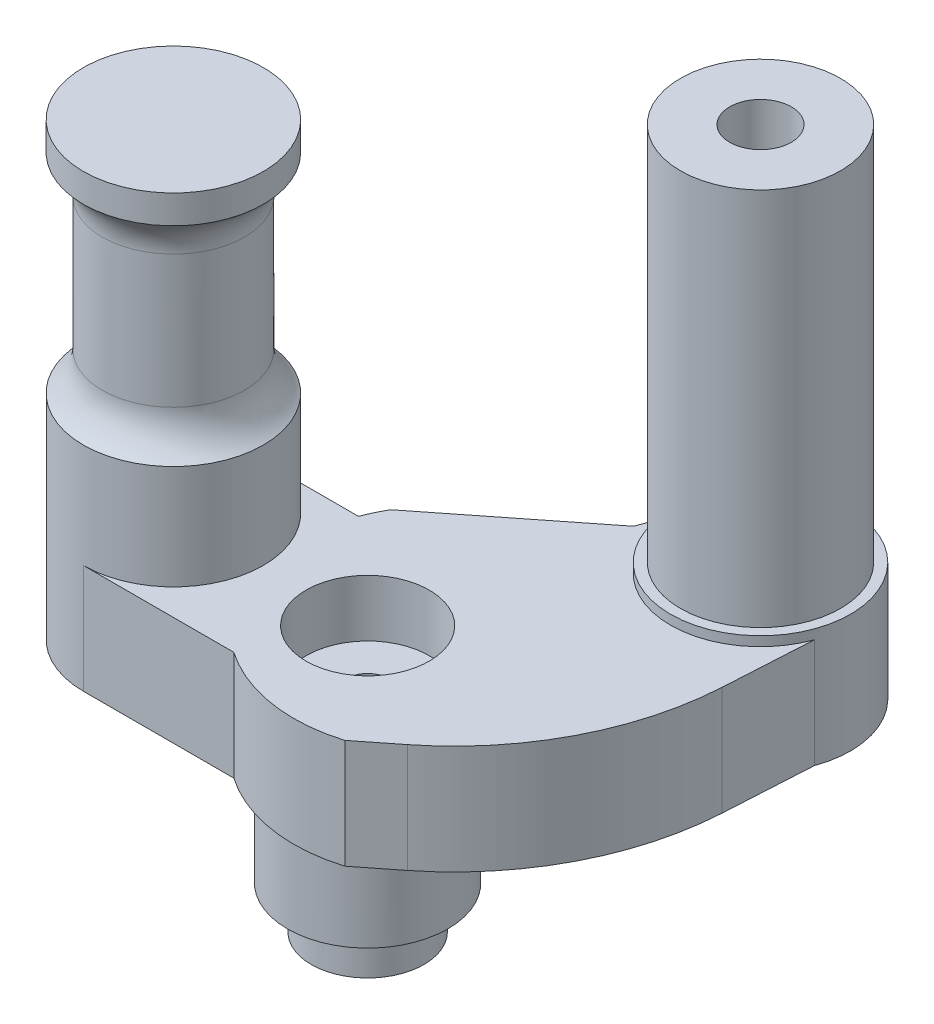
ISO-10303-21;
HEADER;
FILE_DESCRIPTION(('STEP AP214'),'2;1');
FILE_NAME('part.step','',(''),(''),'','','');
FILE_SCHEMA(('AUTOMOTIVE_DESIGN { 1 0 10303 214 1 1 1 1 }'));
ENDSEC;
DATA;
#1=APPLICATION_CONTEXT('core data for automotive mechanical design processes');
#2=APPLICATION_PROTOCOL_DEFINITION('international standard','automotive_design',2000,#1);
#3=PRODUCT_CONTEXT('',#1,'mechanical');
#4=PRODUCT('Part','Part','',(#3));
#5=PRODUCT_RELATED_PRODUCT_CATEGORY('part','',(#4));
#6=PRODUCT_DEFINITION_FORMATION('','',#4);
#7=PRODUCT_DEFINITION_CONTEXT('part definition',#1,'design');
#8=PRODUCT_DEFINITION('design','',#6,#7);
#9=PRODUCT_DEFINITION_SHAPE('','',#8);
#10=(LENGTH_UNIT() NAMED_UNIT(*) SI_UNIT(.MILLI.,.METRE.));
#11=(NAMED_UNIT(*) PLANE_ANGLE_UNIT() SI_UNIT($,.RADIAN.));
#12=(NAMED_UNIT(*) SI_UNIT($,.STERADIAN.) SOLID_ANGLE_UNIT());
#13=UNCERTAINTY_MEASURE_WITH_UNIT(LENGTH_MEASURE(1.E-05),#10,'distance_accuracy_value','');
#14=(GEOMETRIC_REPRESENTATION_CONTEXT(3) GLOBAL_UNCERTAINTY_ASSIGNED_CONTEXT((#13)) GLOBAL_UNIT_ASSIGNED_CONTEXT((#10,
#11,#12)) REPRESENTATION_CONTEXT('',''));
#15=CARTESIAN_POINT('',(0.,0.,0.));
#16=DIRECTION('',(0.,0.,1.));
#17=DIRECTION('',(1.,0.,0.));
#18=AXIS2_PLACEMENT_3D('',#15,#16,#17);
#19=CARTESIAN_POINT('',(-20.5,64.,0.));
#20=DIRECTION('',(0.,-1.,0.));
#21=DIRECTION('',(0.,0.,-1.));
#22=AXIS2_PLACEMENT_3D('',#19,#20,#21);
#23=CYLINDRICAL_SURFACE('',#22,9.5);
#24=CARTESIAN_POINT('',(-20.5,16.5,0.));
#25=DIRECTION('',(0.,1.,0.));
#26=DIRECTION('',(0.,0.,1.));
#27=AXIS2_PLACEMENT_3D('',#24,#25,#26);
#28=CIRCLE('',#27,9.5);
#29=CARTESIAN_POINT('',(-20.5,16.5,9.5));
#30=VERTEX_POINT('',#29);
#31=CARTESIAN_POINT('',(-20.5,16.5,-9.5));
#32=VERTEX_POINT('',#31);
#33=EDGE_CURVE('E189',#30,#32,#28,.F.);
#34=ORIENTED_EDGE('',*,*,#33,.F.);
#35=DIRECTION('',(0.,1.,0.));
#36=VECTOR('',#35,1.);
#37=CARTESIAN_POINT('',(-20.5,9.99999999999999,9.5));
#38=LINE('',#37,#36);
#39=CARTESIAN_POINT('',(-20.5,28.,9.5));
#40=VERTEX_POINT('',#39);
#41=EDGE_CURVE('E187',#30,#40,#38,.T.);
#42=ORIENTED_EDGE('',*,*,#41,.T.);
#43=CARTESIAN_POINT('',(-20.5,28.,0.));
#44=DIRECTION('',(0.,1.,0.));
#45=DIRECTION('',(0.,0.,1.));
#46=AXIS2_PLACEMENT_3D('',#43,#44,#45);
#47=CIRCLE('',#46,9.5);
#48=CARTESIAN_POINT('',(-20.5,28.,-9.5));
#49=VERTEX_POINT('',#48);
#50=EDGE_CURVE('E218',#40,#49,#47,.T.);
#51=ORIENTED_EDGE('',*,*,#50,.T.);
#52=DIRECTION('',(0.,1.,0.));
#53=VECTOR('',#52,1.);
#54=CARTESIAN_POINT('',(-20.5,9.99999999999999,-9.5));
#55=LINE('',#54,#53);
#56=EDGE_CURVE('E191',#32,#49,#55,.T.);
#57=ORIENTED_EDGE('',*,*,#56,.F.);
#58=EDGE_LOOP('',(#34,#42,#51,#57));
#59=FACE_BOUND('',#58,.T.);
#60=CARTESIAN_POINT('',(-20.5,39.,0.));
#61=DIRECTION('',(0.,1.,0.));
#62=DIRECTION('',(0.,0.,1.));
#63=AXIS2_PLACEMENT_3D('',#60,#61,#62);
#64=CIRCLE('',#63,9.5);
#65=CARTESIAN_POINT('',(-20.5,39.,9.5));
#66=VERTEX_POINT('',#65);
#67=EDGE_CURVE('E182',#66,#66,#64,.T.);
#68=ORIENTED_EDGE('',*,*,#67,.F.);
#69=EDGE_LOOP('',(#68));
#70=FACE_BOUND('',#69,.T.);
#71=ADVANCED_FACE('F33',(#59,#70),#23,.T.);
#72=CARTESIAN_POINT('',(0.,29.,0.));
#73=DIRECTION('',(0.,-1.,0.));
#74=DIRECTION('',(0.,0.,-1.));
#75=AXIS2_PLACEMENT_3D('',#72,#73,#74);
#76=CYLINDRICAL_SURFACE('',#75,2.3);
#77=CARTESIAN_POINT('',(0.,0.,0.));
#78=DIRECTION('',(0.,-1.,0.));
#79=DIRECTION('',(0.,0.,-1.));
#80=AXIS2_PLACEMENT_3D('',#77,#78,#79);
#81=CIRCLE('',#80,2.3);
#82=CARTESIAN_POINT('',(0.,0.,-2.3));
#83=VERTEX_POINT('',#82);
#84=EDGE_CURVE('E235',#83,#83,#81,.T.);
#85=ORIENTED_EDGE('',*,*,#84,.T.);
#86=EDGE_LOOP('',(#85));
#87=FACE_BOUND('',#86,.T.);
#88=CARTESIAN_POINT('',(0.,22.,0.));
#89=DIRECTION('',(0.,1.,0.));
#90=DIRECTION('',(0.,0.,1.));
#91=AXIS2_PLACEMENT_3D('',#88,#89,#90);
#92=CIRCLE('',#91,2.3);
#93=CARTESIAN_POINT('',(0.,22.,2.3));
#94=VERTEX_POINT('',#93);
#95=EDGE_CURVE('E232',#94,#94,#92,.F.);
#96=ORIENTED_EDGE('',*,*,#95,.F.);
#97=EDGE_LOOP('',(#96));
#98=FACE_BOUND('',#97,.T.);
#99=ADVANCED_FACE('F304',(#87,#98),#76,.F.);
#100=CARTESIAN_POINT('',(-9.41668533051533,28.,-19.0492008360519));
#101=DIRECTION('',(0.,1.,0.));
#102=DIRECTION('',(0.,0.,1.));
#103=AXIS2_PLACEMENT_3D('',#100,#101,#102);
#104=PLANE('',#103);
#105=DIRECTION('',(0.924538162837202,0.,0.381089471722339));
#106=VECTOR('',#105,1.);
#107=CARTESIAN_POINT('',(7.15538028868898,28.,-29.1348573458794));
#108=LINE('',#107,#106);
#109=CARTESIAN_POINT('',(7.14766163113724,28.,-29.1380389334515));
#110=VERTEX_POINT('',#109);
#111=CARTESIAN_POINT('',(7.15538028868898,28.,-29.1348573458794));
#112=VERTEX_POINT('',#111);
#113=EDGE_CURVE('E183',#110,#112,#108,.T.);
#114=ORIENTED_EDGE('',*,*,#113,.F.);
#115=DIRECTION('',(-0.342020143325673,0.,0.939692620785907));
#116=VECTOR('',#115,1.);
#117=CARTESIAN_POINT('',(2.39485082576202,28.,-16.0797985667433));
#118=LINE('',#117,#116);
#119=CARTESIAN_POINT('',(7.01141293817629,28.,-28.7636987261111));
#120=VERTEX_POINT('',#119);
#121=EDGE_CURVE('E245',#110,#120,#118,.T.);
#122=ORIENTED_EDGE('',*,*,#121,.T.);
#123=CARTESIAN_POINT('',(15.9384928356424,28.,-25.5145073645172));
#124=DIRECTION('',(0.,1.,0.));
#125=DIRECTION('',(0.,0.,1.));
#126=AXIS2_PLACEMENT_3D('',#123,#124,#125);
#127=CIRCLE('',#126,9.50000000000001);
#128=EDGE_CURVE('E223',#112,#120,#127,.T.);
#129=ORIENTED_EDGE('',*,*,#128,.F.);
#130=EDGE_LOOP('',(#114,#122,#129));
#131=FACE_BOUND('',#130,.T.);
#132=ADVANCED_FACE('F309',(#131),#104,.T.);
#133=CARTESIAN_POINT('',(0.,22.25,0.));
#134=DIRECTION('',(0.,-1.,0.));
#135=DIRECTION('',(0.,0.,-1.));
#136=AXIS2_PLACEMENT_3D('',#133,#134,#135);
#137=CYLINDRICAL_SURFACE('',#136,8.45);
#138=CARTESIAN_POINT('',(0.,15.5,0.));
#139=DIRECTION('',(0.,-1.,0.));
#140=DIRECTION('',(0.,0.,-1.));
#141=AXIS2_PLACEMENT_3D('',#138,#139,#140);
#142=CIRCLE('',#141,8.45);
#143=CARTESIAN_POINT('',(0.,15.5,-8.45));
#144=VERTEX_POINT('',#143);
#145=EDGE_CURVE('E212',#144,#144,#142,.T.);
#146=ORIENTED_EDGE('',*,*,#145,.T.);
#147=EDGE_LOOP('',(#146));
#148=FACE_BOUND('',#147,.T.);
#149=CARTESIAN_POINT('',(0.,4.5,0.));
#150=DIRECTION('',(0.,1.,0.));
#151=DIRECTION('',(0.,0.,1.));
#152=AXIS2_PLACEMENT_3D('',#149,#150,#151);
#153=CIRCLE('',#152,8.45);
#154=CARTESIAN_POINT('',(0.,4.5,8.45));
#155=VERTEX_POINT('',#154);
#156=EDGE_CURVE('E258',#155,#155,#153,.T.);
#157=ORIENTED_EDGE('',*,*,#156,.T.);
#158=EDGE_LOOP('',(#157));
#159=FACE_BOUND('',#158,.T.);
#160=ADVANCED_FACE('F354',(#148,#159),#137,.T.);
#161=CARTESIAN_POINT('',(0.,4.5,0.));
#162=DIRECTION('',(0.,-1.,0.));
#163=DIRECTION('',(0.,0.,-1.));
#164=AXIS2_PLACEMENT_3D('',#161,#162,#163);
#165=CYLINDRICAL_SURFACE('',#164,5.95);
#166=CARTESIAN_POINT('',(0.,4.5,0.));
#167=DIRECTION('',(0.,1.,0.));
#168=DIRECTION('',(0.,0.,1.));
#169=AXIS2_PLACEMENT_3D('',#166,#167,#168);
#170=CIRCLE('',#169,5.95);
#171=CARTESIAN_POINT('',(0.,4.5,5.95));
#172=VERTEX_POINT('',#171);
#173=EDGE_CURVE('E262',#172,#172,#170,.T.);
#174=ORIENTED_EDGE('',*,*,#173,.F.);
#175=EDGE_LOOP('',(#174));
#176=FACE_BOUND('',#175,.T.);
#177=CARTESIAN_POINT('',(0.,0.,0.));
#178=DIRECTION('',(0.,1.,0.));
#179=DIRECTION('',(0.,0.,1.));
#180=AXIS2_PLACEMENT_3D('',#177,#178,#179);
#181=CIRCLE('',#180,5.95);
#182=CARTESIAN_POINT('',(0.,0.,5.95));
#183=VERTEX_POINT('',#182);
#184=EDGE_CURVE('E261',#183,#183,#181,.T.);
#185=ORIENTED_EDGE('',*,*,#184,.T.);
#186=EDGE_LOOP('',(#185));
#187=FACE_BOUND('',#186,.T.);
#188=ADVANCED_FACE('F357',(#176,#187),#165,.T.);
#189=CARTESIAN_POINT('',(0.,0.,0.));
#190=DIRECTION('',(0.,1.,0.));
#191=DIRECTION('',(0.,0.,1.));
#192=AXIS2_PLACEMENT_3D('',#189,#190,#191);
#193=PLANE('',#192);
#194=ORIENTED_EDGE('',*,*,#84,.F.);
#195=EDGE_LOOP('',(#194));
#196=FACE_BOUND('',#195,.T.);
#197=ORIENTED_EDGE('',*,*,#184,.F.);
#198=EDGE_LOOP('',(#197));
#199=FACE_BOUND('',#198,.T.);
#200=ADVANCED_FACE('F352',(#196,#199),#193,.F.);
#201=CARTESIAN_POINT('',(0.,4.5,0.));
#202=DIRECTION('',(0.,1.,0.));
#203=DIRECTION('',(0.,0.,1.));
#204=AXIS2_PLACEMENT_3D('',#201,#202,#203);
#205=PLANE('',#204);
#206=ORIENTED_EDGE('',*,*,#173,.T.);
#207=EDGE_LOOP('',(#206));
#208=FACE_BOUND('',#207,.T.);
#209=ORIENTED_EDGE('',*,*,#156,.F.);
#210=EDGE_LOOP('',(#209));
#211=FACE_BOUND('',#210,.T.);
#212=ADVANCED_FACE('F343',(#208,#211),#205,.F.);
#213=CARTESIAN_POINT('',(0.,16.5,9.5));
#214=DIRECTION('',(0.,0.,1.));
#215=DIRECTION('',(1.,0.,0.));
#216=AXIS2_PLACEMENT_3D('',#213,#214,#215);
#217=PLANE('',#216);
#218=DIRECTION('',(0.,-1.,0.));
#219=VECTOR('',#218,1.);
#220=CARTESIAN_POINT('',(-4.6171931560712,79.1003432232158,9.5));
#221=LINE('',#220,#219);
#222=CARTESIAN_POINT('',(-4.6171931560712,28.,9.5));
#223=VERTEX_POINT('',#222);
#224=CARTESIAN_POINT('',(-4.6171931560712,16.5,9.5));
#225=VERTEX_POINT('',#224);
#226=EDGE_CURVE('E52',#223,#225,#221,.T.);
#227=ORIENTED_EDGE('',*,*,#226,.F.);
#228=DIRECTION('',(1.,0.,0.));
#229=VECTOR('',#228,1.);
#230=CARTESIAN_POINT('',(-30.,28.,9.5));
#231=LINE('',#230,#229);
#232=EDGE_CURVE('E250',#40,#223,#231,.T.);
#233=ORIENTED_EDGE('',*,*,#232,.F.);
#234=ORIENTED_EDGE('',*,*,#41,.F.);
#235=DIRECTION('',(1.,0.,0.));
#236=VECTOR('',#235,1.);
#237=CARTESIAN_POINT('',(-30.,16.5,9.5));
#238=LINE('',#237,#236);
#239=EDGE_CURVE('E48',#30,#225,#238,.T.);
#240=ORIENTED_EDGE('',*,*,#239,.T.);
#241=EDGE_LOOP('',(#227,#233,#234,#240));
#242=FACE_BOUND('',#241,.T.);
#243=ADVANCED_FACE('F339',(#242),#217,.T.);
#244=CARTESIAN_POINT('',(-7.00207538209712,16.5,-9.5));
#245=DIRECTION('',(0.,0.,-1.));
#246=DIRECTION('',(-1.,0.,0.));
#247=AXIS2_PLACEMENT_3D('',#244,#245,#246);
#248=PLANE('',#247);
#249=DIRECTION('',(0.,-1.,0.));
#250=VECTOR('',#249,1.);
#251=CARTESIAN_POINT('',(-10.4713346025976,79.1003432232158,-9.5));
#252=LINE('',#251,#250);
#253=CARTESIAN_POINT('',(-10.4713346025976,16.5,-9.5));
#254=VERTEX_POINT('',#253);
#255=CARTESIAN_POINT('',(-10.4713346025976,28.,-9.5));
#256=VERTEX_POINT('',#255);
#257=EDGE_CURVE('E152',#254,#256,#252,.F.);
#258=ORIENTED_EDGE('',*,*,#257,.F.);
#259=DIRECTION('',(-1.,0.,0.));
#260=VECTOR('',#259,1.);
#261=CARTESIAN_POINT('',(-7.00207538209712,16.5,-9.5));
#262=LINE('',#261,#260);
#263=EDGE_CURVE('E255',#254,#32,#262,.T.);
#264=ORIENTED_EDGE('',*,*,#263,.T.);
#265=ORIENTED_EDGE('',*,*,#56,.T.);
#266=DIRECTION('',(-1.,0.,0.));
#267=VECTOR('',#266,1.);
#268=CARTESIAN_POINT('',(-7.00207538209712,28.,-9.5));
#269=LINE('',#268,#267);
#270=EDGE_CURVE('E247',#256,#49,#269,.T.);
#271=ORIENTED_EDGE('',*,*,#270,.F.);
#272=EDGE_LOOP('',(#258,#264,#265,#271));
#273=FACE_BOUND('',#272,.T.);
#274=ADVANCED_FACE('F342',(#273),#248,.T.);
#275=CARTESIAN_POINT('',(2.39485082576202,16.5,-16.0797985667433));
#276=DIRECTION('',(-0.939692620785907,0.,-0.342020143325673));
#277=DIRECTION('',(-0.342020143325673,0.,0.939692620785907));
#278=AXIS2_PLACEMENT_3D('',#275,#276,#277);
#279=PLANE('',#278);
#280=DIRECTION('',(0.,-1.,0.));
#281=VECTOR('',#280,1.);
#282=CARTESIAN_POINT('',(4.95541630779919,16.5,-23.1148944096753));
#283=LINE('',#282,#281);
#284=CARTESIAN_POINT('',(4.95541630779919,28.,-23.1148944096753));
#285=VERTEX_POINT('',#284);
#286=CARTESIAN_POINT('',(4.95541630779919,16.5,-23.1148944096753));
#287=VERTEX_POINT('',#286);
#288=EDGE_CURVE('E150',#285,#287,#283,.T.);
#289=ORIENTED_EDGE('',*,*,#288,.F.);
#290=EDGE_CURVE('E241',#120,#285,#118,.T.);
#291=ORIENTED_EDGE('',*,*,#290,.F.);
#292=ORIENTED_EDGE('',*,*,#121,.F.);
#293=DIRECTION('',(0.,1.,0.));
#294=VECTOR('',#293,1.);
#295=CARTESIAN_POINT('',(7.14766163113724,16.5,-29.1380389334515));
#296=LINE('',#295,#294);
#297=CARTESIAN_POINT('',(7.14766163113724,16.5,-29.1380389334515));
#298=VERTEX_POINT('',#297);
#299=EDGE_CURVE('E200',#298,#110,#296,.T.);
#300=ORIENTED_EDGE('',*,*,#299,.F.);
#301=DIRECTION('',(-0.342020143325673,0.,0.939692620785907));
#302=VECTOR('',#301,1.);
#303=CARTESIAN_POINT('',(2.39485082576202,16.5,-16.0797985667433));
#304=LINE('',#303,#302);
#305=EDGE_CURVE('E252',#298,#287,#304,.T.);
#306=ORIENTED_EDGE('',*,*,#305,.T.);
#307=EDGE_LOOP('',(#289,#291,#292,#300,#306));
#308=FACE_BOUND('',#307,.T.);
#309=ADVANCED_FACE('F337',(#308),#279,.T.);
#310=CARTESIAN_POINT('',(-9.41668533051533,16.5,-19.0492008360519));
#311=DIRECTION('',(0.,1.,0.));
#312=DIRECTION('',(0.,0.,1.));
#313=AXIS2_PLACEMENT_3D('',#310,#311,#312);
#314=PLANE('',#313);
#315=CARTESIAN_POINT('',(0.,16.5,0.));
#316=DIRECTION('',(0.,-1.,0.));
#317=DIRECTION('',(0.,0.,-1.));
#318=AXIS2_PLACEMENT_3D('',#315,#316,#317);
#319=CIRCLE('',#318,9.5);
#320=CARTESIAN_POINT('',(0.,16.5,-9.5));
#321=VERTEX_POINT('',#320);
#322=EDGE_CURVE('E206',#321,#321,#319,.T.);
#323=ORIENTED_EDGE('',*,*,#322,.F.);
#324=EDGE_LOOP('',(#323));
#325=FACE_BOUND('',#324,.T.);
#326=ORIENTED_EDGE('',*,*,#263,.F.);
#327=CARTESIAN_POINT('',(4.59066256217014,16.5,-3.73892504377688));
#328=DIRECTION('',(0.,-1.,0.));
#329=DIRECTION('',(0.,0.,-1.));
#330=AXIS2_PLACEMENT_3D('',#327,#328,#329);
#331=CIRCLE('',#330,16.1261819176981);
#332=CARTESIAN_POINT('',(-9.37187276386306,16.5,-11.8074658357644));
#333=VERTEX_POINT('',#332);
#334=EDGE_CURVE('E142',#254,#333,#331,.T.);
#335=ORIENTED_EDGE('',*,*,#334,.T.);
#336=DIRECTION('',(0.784978393682861,0.,-0.619523140367714));
#337=VECTOR('',#336,1.);
#338=CARTESIAN_POINT('',(-9.37187276386306,16.5,-11.8074658357644));
#339=LINE('',#338,#337);
#340=EDGE_CURVE('E141',#333,#287,#339,.T.);
#341=ORIENTED_EDGE('',*,*,#340,.T.);
#342=ORIENTED_EDGE('',*,*,#305,.F.);
#343=DIRECTION('',(0.924538162837202,0.,0.381089471722339));
#344=VECTOR('',#343,1.);
#345=CARTESIAN_POINT('',(-3.45644062979212,16.5,-33.5089907136419));
#346=LINE('',#345,#344);
#347=CARTESIAN_POINT('',(7.15538028868898,16.5,-29.1348573458794));
#348=VERTEX_POINT('',#347);
#349=EDGE_CURVE('E222',#298,#348,#346,.T.);
#350=ORIENTED_EDGE('',*,*,#349,.T.);
#351=CARTESIAN_POINT('',(15.9384928356424,16.5,-25.5145073645172));
#352=DIRECTION('',(0.,1.,0.));
#353=DIRECTION('',(0.,0.,1.));
#354=AXIS2_PLACEMENT_3D('',#351,#352,#353);
#355=CIRCLE('',#354,9.50000000000001);
#356=CARTESIAN_POINT('',(24.8655727331087,16.5,-22.2653160029239));
#357=VERTEX_POINT('',#356);
#358=EDGE_CURVE('E197',#348,#357,#355,.F.);
#359=ORIENTED_EDGE('',*,*,#358,.T.);
#360=DIRECTION('',(-0.0572306718588554,0.,0.998360981909141));
#361=VECTOR('',#360,1.);
#362=CARTESIAN_POINT('',(24.3377118734044,16.5,-13.0570423781533));
#363=LINE('',#362,#361);
#364=CARTESIAN_POINT('',(24.3377118734044,16.5,-13.0570423781533));
#365=VERTEX_POINT('',#364);
#366=EDGE_CURVE('E154',#357,#365,#363,.T.);
#367=ORIENTED_EDGE('',*,*,#366,.T.);
#368=CARTESIAN_POINT('',(-5.61311758386982,16.5,-14.7739625339188));
#369=DIRECTION('',(0.,-1.,0.));
#370=DIRECTION('',(0.,0.,1.));
#371=AXIS2_PLACEMENT_3D('',#368,#369,#370);
#372=CIRCLE('',#371,30.);
#373=CARTESIAN_POINT('',(12.9725766271616,16.5,8.77538927656692));
#374=VERTEX_POINT('',#373);
#375=EDGE_CURVE('E149',#365,#374,#372,.T.);
#376=ORIENTED_EDGE('',*,*,#375,.T.);
#377=DIRECTION('',(-0.784978393682861,0.,0.619523140367714));
#378=VECTOR('',#377,1.);
#379=CARTESIAN_POINT('',(9.27848203552014,16.5,11.6908543398687));
#380=LINE('',#379,#378);
#381=CARTESIAN_POINT('',(9.27848203552014,16.5,11.6908543398687));
#382=VERTEX_POINT('',#381);
#383=EDGE_CURVE('E131',#374,#382,#380,.T.);
#384=ORIENTED_EDGE('',*,*,#383,.T.);
#385=EDGE_CURVE('E138',#382,#225,#331,.T.);
#386=ORIENTED_EDGE('',*,*,#385,.T.);
#387=ORIENTED_EDGE('',*,*,#239,.F.);
#388=ORIENTED_EDGE('',*,*,#33,.T.);
#389=EDGE_LOOP('',(#326,#335,#341,#342,#350,#359,#367,#376,#384,#386,#387,#388));
#390=FACE_BOUND('',#389,.T.);
#391=ADVANCED_FACE('F146',(#325,#390),#314,.F.);
#392=ORIENTED_EDGE('',*,*,#232,.T.);
#393=CARTESIAN_POINT('',(4.59066256217014,28.,-3.73892504377688));
#394=DIRECTION('',(0.,1.,0.));
#395=DIRECTION('',(0.,0.,1.));
#396=AXIS2_PLACEMENT_3D('',#393,#394,#395);
#397=CIRCLE('',#396,16.1261819176981);
#398=CARTESIAN_POINT('',(9.27848203552014,28.,11.6908543398687));
#399=VERTEX_POINT('',#398);
#400=EDGE_CURVE('E163',#399,#223,#397,.F.);
#401=ORIENTED_EDGE('',*,*,#400,.F.);
#402=DIRECTION('',(-0.784978393682861,0.,0.619523140367714));
#403=VECTOR('',#402,1.);
#404=CARTESIAN_POINT('',(9.27848203552014,28.,11.6908543398687));
#405=LINE('',#404,#403);
#406=CARTESIAN_POINT('',(12.9725766271616,28.,8.77538927656697));
#407=VERTEX_POINT('',#406);
#408=EDGE_CURVE('E132',#407,#399,#405,.T.);
#409=ORIENTED_EDGE('',*,*,#408,.F.);
#410=CARTESIAN_POINT('',(-5.61311758386982,28.,-14.7739625339188));
#411=DIRECTION('',(0.,1.,0.));
#412=DIRECTION('',(0.,0.,1.));
#413=AXIS2_PLACEMENT_3D('',#410,#411,#412);
#414=CIRCLE('',#413,30.);
#415=CARTESIAN_POINT('',(24.3377118734044,28.,-13.0570423781533));
#416=VERTEX_POINT('',#415);
#417=EDGE_CURVE('E135',#416,#407,#414,.F.);
#418=ORIENTED_EDGE('',*,*,#417,.F.);
#419=DIRECTION('',(-0.0572306718588554,0.,0.998360981909141));
#420=VECTOR('',#419,1.);
#421=CARTESIAN_POINT('',(24.3377118734044,28.,-13.0570423781533));
#422=LINE('',#421,#420);
#423=CARTESIAN_POINT('',(24.8655727331085,28.,-22.2653160029232));
#424=VERTEX_POINT('',#423);
#425=EDGE_CURVE('E171',#424,#416,#422,.T.);
#426=ORIENTED_EDGE('',*,*,#425,.F.);
#427=EDGE_CURVE('E244',#120,#424,#127,.T.);
#428=ORIENTED_EDGE('',*,*,#427,.F.);
#429=ORIENTED_EDGE('',*,*,#290,.T.);
#430=DIRECTION('',(0.784978393682861,0.,-0.619523140367714));
#431=VECTOR('',#430,1.);
#432=CARTESIAN_POINT('',(-9.37187276386306,28.,-11.8074658357644));
#433=LINE('',#432,#431);
#434=CARTESIAN_POINT('',(-9.37187276386306,28.,-11.8074658357644));
#435=VERTEX_POINT('',#434);
#436=EDGE_CURVE('E160',#435,#285,#433,.T.);
#437=ORIENTED_EDGE('',*,*,#436,.F.);
#438=EDGE_CURVE('E166',#256,#435,#397,.F.);
#439=ORIENTED_EDGE('',*,*,#438,.F.);
#440=ORIENTED_EDGE('',*,*,#270,.T.);
#441=ORIENTED_EDGE('',*,*,#50,.F.);
#442=EDGE_LOOP('',(#392,#401,#409,#418,#426,#428,#429,#437,#439,#440,#441));
#443=FACE_BOUND('',#442,.T.);
#444=CARTESIAN_POINT('',(0.,28.,0.));
#445=DIRECTION('',(0.,1.,0.));
#446=DIRECTION('',(0.,0.,1.));
#447=AXIS2_PLACEMENT_3D('',#444,#445,#446);
#448=CIRCLE('',#447,6.5);
#449=CARTESIAN_POINT('',(0.,28.,6.5));
#450=VERTEX_POINT('',#449);
#451=EDGE_CURVE('E227',#450,#450,#448,.T.);
#452=ORIENTED_EDGE('',*,*,#451,.F.);
#453=EDGE_LOOP('',(#452));
#454=FACE_BOUND('',#453,.T.);
#455=ADVANCED_FACE('F330',(#443,#454),#104,.T.);
#456=CARTESIAN_POINT('',(15.9384928356424,29.,-25.5145073645172));
#457=DIRECTION('',(0.,-1.,0.));
#458=DIRECTION('',(0.,0.,-1.));
#459=AXIS2_PLACEMENT_3D('',#456,#457,#458);
#460=CYLINDRICAL_SURFACE('',#459,9.50000000000001);
#461=ORIENTED_EDGE('',*,*,#427,.T.);
#462=DIRECTION('',(0.,-1.,0.));
#463=VECTOR('',#462,1.);
#464=CARTESIAN_POINT('',(24.8655727331087,79.1003432232158,-22.2653160029231));
#465=LINE('',#464,#463);
#466=EDGE_CURVE('E162',#424,#357,#465,.T.);
#467=ORIENTED_EDGE('',*,*,#466,.T.);
#468=ORIENTED_EDGE('',*,*,#358,.F.);
#469=DIRECTION('',(0.,1.,0.));
#470=VECTOR('',#469,1.);
#471=CARTESIAN_POINT('',(7.15538028868898,9.99999999999999,-29.1348573458794));
#472=LINE('',#471,#470);
#473=EDGE_CURVE('E186',#348,#112,#472,.T.);
#474=ORIENTED_EDGE('',*,*,#473,.T.);
#475=ORIENTED_EDGE('',*,*,#128,.T.);
#476=EDGE_LOOP('',(#461,#467,#468,#474,#475));
#477=FACE_BOUND('',#476,.T.);
#478=CARTESIAN_POINT('',(15.9384928356424,29.,-25.5145073645172));
#479=DIRECTION('',(0.,1.,0.));
#480=DIRECTION('',(0.,0.,1.));
#481=AXIS2_PLACEMENT_3D('',#478,#479,#480);
#482=CIRCLE('',#481,9.50000000000001);
#483=CARTESIAN_POINT('',(15.9384928356424,29.,-16.0145073645172));
#484=VERTEX_POINT('',#483);
#485=EDGE_CURVE('E238',#484,#484,#482,.T.);
#486=ORIENTED_EDGE('',*,*,#485,.F.);
#487=EDGE_LOOP('',(#486));
#488=FACE_BOUND('',#487,.T.);
#489=ADVANCED_FACE('F326',(#477,#488),#460,.T.);
#490=CARTESIAN_POINT('',(15.9384928356424,29.,-25.5145073645172));
#491=DIRECTION('',(0.,1.,0.));
#492=DIRECTION('',(0.,0.,1.));
#493=AXIS2_PLACEMENT_3D('',#490,#491,#492);
#494=PLANE('',#493);
#495=CARTESIAN_POINT('',(15.9384928356424,29.,-25.5145073645172));
#496=DIRECTION('',(0.,1.,0.));
#497=DIRECTION('',(0.,0.,1.));
#498=AXIS2_PLACEMENT_3D('',#495,#496,#497);
#499=CIRCLE('',#498,8.45);
#500=CARTESIAN_POINT('',(15.9384928356424,29.,-17.0645073645172));
#501=VERTEX_POINT('',#500);
#502=EDGE_CURVE('E219',#501,#501,#499,.T.);
#503=ORIENTED_EDGE('',*,*,#502,.F.);
#504=EDGE_LOOP('',(#503));
#505=FACE_BOUND('',#504,.T.);
#506=ORIENTED_EDGE('',*,*,#485,.T.);
#507=EDGE_LOOP('',(#506));
#508=FACE_BOUND('',#507,.T.);
#509=ADVANCED_FACE('F318',(#505,#508),#494,.T.);
#510=CARTESIAN_POINT('',(0.,22.,0.));
#511=DIRECTION('',(0.,1.,0.));
#512=DIRECTION('',(0.,0.,1.));
#513=AXIS2_PLACEMENT_3D('',#510,#511,#512);
#514=PLANE('',#513);
#515=CARTESIAN_POINT('',(0.,22.,0.));
#516=DIRECTION('',(0.,1.,0.));
#517=DIRECTION('',(0.,0.,1.));
#518=AXIS2_PLACEMENT_3D('',#515,#516,#517);
#519=CIRCLE('',#518,6.5);
#520=CARTESIAN_POINT('',(0.,22.,6.5));
#521=VERTEX_POINT('',#520);
#522=EDGE_CURVE('E229',#521,#521,#519,.T.);
#523=ORIENTED_EDGE('',*,*,#522,.T.);
#524=EDGE_LOOP('',(#523));
#525=FACE_BOUND('',#524,.T.);
#526=ORIENTED_EDGE('',*,*,#95,.T.);
#527=EDGE_LOOP('',(#526));
#528=FACE_BOUND('',#527,.T.);
#529=ADVANCED_FACE('F314',(#525,#528),#514,.T.);
#530=CARTESIAN_POINT('',(0.,22.,0.));
#531=DIRECTION('',(0.,1.,0.));
#532=DIRECTION('',(0.,0.,1.));
#533=AXIS2_PLACEMENT_3D('',#530,#531,#532);
#534=CYLINDRICAL_SURFACE('',#533,6.5);
#535=ORIENTED_EDGE('',*,*,#522,.F.);
#536=EDGE_LOOP('',(#535));
#537=FACE_BOUND('',#536,.T.);
#538=ORIENTED_EDGE('',*,*,#451,.T.);
#539=EDGE_LOOP('',(#538));
#540=FACE_BOUND('',#539,.T.);
#541=ADVANCED_FACE('F317',(#537,#540),#534,.F.);
#542=CARTESIAN_POINT('',(15.9384928356424,69.,-25.5145073645172));
#543=DIRECTION('',(0.,-1.,0.));
#544=DIRECTION('',(0.,0.,-1.));
#545=AXIS2_PLACEMENT_3D('',#542,#543,#544);
#546=CYLINDRICAL_SURFACE('',#545,8.45);
#547=CARTESIAN_POINT('',(15.9384928356424,69.,-25.5145073645172));
#548=DIRECTION('',(0.,1.,0.));
#549=DIRECTION('',(0.,0.,1.));
#550=AXIS2_PLACEMENT_3D('',#547,#548,#549);
#551=CIRCLE('',#550,8.45);
#552=CARTESIAN_POINT('',(15.9384928356424,69.,-17.0645073645172));
#553=VERTEX_POINT('',#552);
#554=EDGE_CURVE('E215',#553,#553,#551,.T.);
#555=ORIENTED_EDGE('',*,*,#554,.F.);
#556=EDGE_LOOP('',(#555));
#557=FACE_BOUND('',#556,.T.);
#558=ORIENTED_EDGE('',*,*,#502,.T.);
#559=EDGE_LOOP('',(#558));
#560=FACE_BOUND('',#559,.T.);
#561=ADVANCED_FACE('F321',(#557,#560),#546,.T.);
#562=CARTESIAN_POINT('',(15.9384928356424,69.,-25.5145073645172));
#563=DIRECTION('',(0.,1.,0.));
#564=DIRECTION('',(0.,0.,1.));
#565=AXIS2_PLACEMENT_3D('',#562,#563,#564);
#566=PLANE('',#565);
#567=CARTESIAN_POINT('',(15.9384928356424,69.,-25.5145073645172));
#568=DIRECTION('',(0.,1.,0.));
#569=DIRECTION('',(0.,0.,1.));
#570=AXIS2_PLACEMENT_3D('',#567,#568,#569);
#571=CIRCLE('',#570,3.25);
#572=CARTESIAN_POINT('',(15.9384928356424,69.,-22.2645073645172));
#573=VERTEX_POINT('',#572);
#574=EDGE_CURVE('E202',#573,#573,#571,.T.);
#575=ORIENTED_EDGE('',*,*,#574,.F.);
#576=EDGE_LOOP('',(#575));
#577=FACE_BOUND('',#576,.T.);
#578=ORIENTED_EDGE('',*,*,#554,.T.);
#579=EDGE_LOOP('',(#578));
#580=FACE_BOUND('',#579,.T.);
#581=ADVANCED_FACE('F510',(#577,#580),#566,.T.);
#582=CARTESIAN_POINT('',(0.,15.5,0.));
#583=DIRECTION('',(0.,-1.,0.));
#584=DIRECTION('',(0.,0.,-1.));
#585=AXIS2_PLACEMENT_3D('',#582,#583,#584);
#586=PLANE('',#585);
#587=ORIENTED_EDGE('',*,*,#145,.F.);
#588=EDGE_LOOP('',(#587));
#589=FACE_BOUND('',#588,.T.);
#590=CARTESIAN_POINT('',(0.,15.5,0.));
#591=DIRECTION('',(0.,-1.,0.));
#592=DIRECTION('',(0.,0.,-1.));
#593=AXIS2_PLACEMENT_3D('',#590,#591,#592);
#594=CIRCLE('',#593,9.5);
#595=CARTESIAN_POINT('',(0.,15.5,-9.5));
#596=VERTEX_POINT('',#595);
#597=EDGE_CURVE('E209',#596,#596,#594,.T.);
#598=ORIENTED_EDGE('',*,*,#597,.T.);
#599=EDGE_LOOP('',(#598));
#600=FACE_BOUND('',#599,.T.);
#601=ADVANCED_FACE('F518',(#589,#600),#586,.T.);
#602=CARTESIAN_POINT('',(0.,15.5,0.));
#603=DIRECTION('',(0.,1.,0.));
#604=DIRECTION('',(0.,0.,1.));
#605=AXIS2_PLACEMENT_3D('',#602,#603,#604);
#606=CYLINDRICAL_SURFACE('',#605,9.5);
#607=ORIENTED_EDGE('',*,*,#597,.F.);
#608=EDGE_LOOP('',(#607));
#609=FACE_BOUND('',#608,.T.);
#610=ORIENTED_EDGE('',*,*,#322,.T.);
#611=EDGE_LOOP('',(#610));
#612=FACE_BOUND('',#611,.T.);
#613=ADVANCED_FACE('F527',(#609,#612),#606,.T.);
#614=CARTESIAN_POINT('',(15.9384928356424,61.,-25.5145073645172));
#615=DIRECTION('',(0.,1.,0.));
#616=DIRECTION('',(0.,0.,1.));
#617=AXIS2_PLACEMENT_3D('',#614,#615,#616);
#618=CYLINDRICAL_SURFACE('',#617,3.25);
#619=CARTESIAN_POINT('',(15.9384928356424,61.,-25.5145073645172));
#620=DIRECTION('',(0.,1.,0.));
#621=DIRECTION('',(0.,0.,1.));
#622=AXIS2_PLACEMENT_3D('',#619,#620,#621);
#623=CIRCLE('',#622,3.25);
#624=CARTESIAN_POINT('',(15.9384928356424,61.,-22.2645073645172));
#625=VERTEX_POINT('',#624);
#626=EDGE_CURVE('E203',#625,#625,#623,.T.);
#627=ORIENTED_EDGE('',*,*,#626,.F.);
#628=EDGE_LOOP('',(#627));
#629=FACE_BOUND('',#628,.T.);
#630=ORIENTED_EDGE('',*,*,#574,.T.);
#631=EDGE_LOOP('',(#630));
#632=FACE_BOUND('',#631,.T.);
#633=ADVANCED_FACE('F535',(#629,#632),#618,.F.);
#634=CARTESIAN_POINT('',(15.9384928356424,61.,-25.5145073645172));
#635=DIRECTION('',(0.,1.,0.));
#636=DIRECTION('',(0.,0.,1.));
#637=AXIS2_PLACEMENT_3D('',#634,#635,#636);
#638=PLANE('',#637);
#639=ORIENTED_EDGE('',*,*,#626,.T.);
#640=EDGE_LOOP('',(#639));
#641=FACE_BOUND('',#640,.T.);
#642=ADVANCED_FACE('F542',(#641),#638,.T.);
#643=CARTESIAN_POINT('',(7.15538028868898,9.99999999999999,-29.1348573458794));
#644=DIRECTION('',(-0.381089471722339,0.,0.924538162837202));
#645=DIRECTION('',(0.924538162837202,0.,0.381089471722339));
#646=AXIS2_PLACEMENT_3D('',#643,#644,#645);
#647=PLANE('',#646);
#648=ORIENTED_EDGE('',*,*,#299,.T.);
#649=ORIENTED_EDGE('',*,*,#113,.T.);
#650=ORIENTED_EDGE('',*,*,#473,.F.);
#651=ORIENTED_EDGE('',*,*,#349,.F.);
#652=EDGE_LOOP('',(#648,#649,#650,#651));
#653=FACE_BOUND('',#652,.T.);
#654=ADVANCED_FACE('F299',(#653),#647,.F.);
#655=CARTESIAN_POINT('',(-20.5,61.,0.));
#656=DIRECTION('',(0.,-1.,0.));
#657=DIRECTION('',(0.,0.,-1.));
#658=AXIS2_PLACEMENT_3D('',#655,#656,#657);
#659=CYLINDRICAL_SURFACE('',#658,7.5);
#660=CARTESIAN_POINT('',(-20.5,43.,0.));
#661=DIRECTION('',(0.,-1.,0.));
#662=DIRECTION('',(0.,0.,-1.));
#663=AXIS2_PLACEMENT_3D('',#660,#661,#662);
#664=CIRCLE('',#663,7.5);
#665=CARTESIAN_POINT('',(-20.5,43.,-7.5));
#666=VERTEX_POINT('',#665);
#667=EDGE_CURVE('E11',#666,#666,#664,.F.);
#668=ORIENTED_EDGE('',*,*,#667,.T.);
#669=EDGE_LOOP('',(#668));
#670=FACE_BOUND('',#669,.T.);
#671=CARTESIAN_POINT('',(-20.5,57.,0.));
#672=DIRECTION('',(0.,1.,0.));
#673=DIRECTION('',(0.,0.,1.));
#674=AXIS2_PLACEMENT_3D('',#671,#672,#673);
#675=CIRCLE('',#674,7.5);
#676=CARTESIAN_POINT('',(-20.5,57.,7.5));
#677=VERTEX_POINT('',#676);
#678=EDGE_CURVE('E41',#677,#677,#675,.F.);
#679=ORIENTED_EDGE('',*,*,#678,.T.);
#680=EDGE_LOOP('',(#679));
#681=FACE_BOUND('',#680,.T.);
#682=ADVANCED_FACE('F279',(#670,#681),#659,.T.);
#683=CARTESIAN_POINT('',(-20.5,64.,0.));
#684=DIRECTION('',(0.,1.,0.));
#685=DIRECTION('',(0.,0.,1.));
#686=AXIS2_PLACEMENT_3D('',#683,#684,#685);
#687=PLANE('',#686);
#688=CARTESIAN_POINT('',(-20.5,64.,0.));
#689=DIRECTION('',(0.,1.,0.));
#690=DIRECTION('',(0.,0.,1.));
#691=AXIS2_PLACEMENT_3D('',#688,#689,#690);
#692=CIRCLE('',#691,9.5);
#693=CARTESIAN_POINT('',(-20.5,64.,9.5));
#694=VERTEX_POINT('',#693);
#695=EDGE_CURVE('E224',#694,#694,#692,.T.);
#696=ORIENTED_EDGE('',*,*,#695,.T.);
#697=EDGE_LOOP('',(#696));
#698=FACE_BOUND('',#697,.T.);
#699=ADVANCED_FACE('F290',(#698),#687,.T.);
#700=CARTESIAN_POINT('',(-20.5,61.,0.));
#701=DIRECTION('',(0.,1.,0.));
#702=DIRECTION('',(0.,0.,1.));
#703=AXIS2_PLACEMENT_3D('',#700,#701,#702);
#704=CIRCLE('',#703,9.5);
#705=CARTESIAN_POINT('',(-20.5,61.,9.5));
#706=VERTEX_POINT('',#705);
#707=EDGE_CURVE('E194',#706,#706,#704,.T.);
#708=ORIENTED_EDGE('',*,*,#707,.T.);
#709=EDGE_LOOP('',(#708));
#710=FACE_BOUND('',#709,.T.);
#711=ORIENTED_EDGE('',*,*,#695,.F.);
#712=EDGE_LOOP('',(#711));
#713=FACE_BOUND('',#712,.T.);
#714=ADVANCED_FACE('F287',(#710,#713),#23,.T.);
#715=CARTESIAN_POINT('',(-20.5,43.,0.));
#716=DIRECTION('',(0.,-1.,0.));
#717=DIRECTION('',(0.,0.,-1.));
#718=AXIS2_PLACEMENT_3D('',#715,#716,#717);
#719=TOROIDAL_SURFACE('',#718,12.5,5.);
#720=ORIENTED_EDGE('',*,*,#67,.T.);
#721=EDGE_LOOP('',(#720));
#722=FACE_BOUND('',#721,.T.);
#723=ORIENTED_EDGE('',*,*,#667,.F.);
#724=EDGE_LOOP('',(#723));
#725=FACE_BOUND('',#724,.T.);
#726=ADVANCED_FACE('F284',(#722,#725),#719,.F.);
#727=CARTESIAN_POINT('',(-20.5,57.,0.));
#728=DIRECTION('',(0.,1.,0.));
#729=DIRECTION('',(0.,0.,1.));
#730=AXIS2_PLACEMENT_3D('',#727,#728,#729);
#731=TOROIDAL_SURFACE('',#730,12.5,5.);
#732=ORIENTED_EDGE('',*,*,#678,.F.);
#733=EDGE_LOOP('',(#732));
#734=FACE_BOUND('',#733,.T.);
#735=ORIENTED_EDGE('',*,*,#707,.F.);
#736=EDGE_LOOP('',(#735));
#737=FACE_BOUND('',#736,.T.);
#738=ADVANCED_FACE('F35',(#734,#737),#731,.F.);
#739=CARTESIAN_POINT('',(-5.61311758386982,79.1003432232158,-14.7739625339188));
#740=DIRECTION('',(0.,-1.,0.));
#741=DIRECTION('',(0.,0.,-1.));
#742=AXIS2_PLACEMENT_3D('',#739,#740,#741);
#743=CYLINDRICAL_SURFACE('',#742,30.);
#744=DIRECTION('',(0.,-1.,0.));
#745=VECTOR('',#744,1.);
#746=CARTESIAN_POINT('',(24.3377118734044,79.1003432232158,-13.0570423781533));
#747=LINE('',#746,#745);
#748=EDGE_CURVE('E173',#416,#365,#747,.T.);
#749=ORIENTED_EDGE('',*,*,#748,.F.);
#750=ORIENTED_EDGE('',*,*,#417,.T.);
#751=DIRECTION('',(0.,-1.,0.));
#752=VECTOR('',#751,1.);
#753=CARTESIAN_POINT('',(12.9725766271616,79.1003432232158,8.77538927656692));
#754=LINE('',#753,#752);
#755=EDGE_CURVE('E170',#407,#374,#754,.T.);
#756=ORIENTED_EDGE('',*,*,#755,.T.);
#757=ORIENTED_EDGE('',*,*,#375,.F.);
#758=EDGE_LOOP('',(#749,#750,#756,#757));
#759=FACE_BOUND('',#758,.T.);
#760=ADVANCED_FACE('F283',(#759),#743,.T.);
#761=CARTESIAN_POINT('',(9.27848203552014,79.1003432232158,11.6908543398687));
#762=DIRECTION('',(0.619523140367714,0.,0.784978393682861));
#763=DIRECTION('',(0.784978393682861,0.,-0.619523140367714));
#764=AXIS2_PLACEMENT_3D('',#761,#762,#763);
#765=PLANE('',#764);
#766=ORIENTED_EDGE('',*,*,#755,.F.);
#767=ORIENTED_EDGE('',*,*,#408,.T.);
#768=DIRECTION('',(0.,-1.,0.));
#769=VECTOR('',#768,1.);
#770=CARTESIAN_POINT('',(9.27848203552014,79.1003432232158,11.6908543398687));
#771=LINE('',#770,#769);
#772=EDGE_CURVE('E126',#399,#382,#771,.T.);
#773=ORIENTED_EDGE('',*,*,#772,.T.);
#774=ORIENTED_EDGE('',*,*,#383,.F.);
#775=EDGE_LOOP('',(#766,#767,#773,#774));
#776=FACE_BOUND('',#775,.T.);
#777=ADVANCED_FACE('F129',(#776),#765,.T.);
#778=CARTESIAN_POINT('',(24.3377118734044,79.1003432232158,-13.0570423781533));
#779=DIRECTION('',(0.998360981909141,0.,0.0572306718588554));
#780=DIRECTION('',(0.0572306718588554,0.,-0.998360981909141));
#781=AXIS2_PLACEMENT_3D('',#778,#779,#780);
#782=PLANE('',#781);
#783=ORIENTED_EDGE('',*,*,#466,.F.);
#784=ORIENTED_EDGE('',*,*,#425,.T.);
#785=ORIENTED_EDGE('',*,*,#748,.T.);
#786=ORIENTED_EDGE('',*,*,#366,.F.);
#787=EDGE_LOOP('',(#783,#784,#785,#786));
#788=FACE_BOUND('',#787,.T.);
#789=ADVANCED_FACE('F392',(#788),#782,.T.);
#790=CARTESIAN_POINT('',(4.59066256217014,79.1003432232158,-3.73892504377688));
#791=DIRECTION('',(0.,-1.,0.));
#792=DIRECTION('',(0.,0.,-1.));
#793=AXIS2_PLACEMENT_3D('',#790,#791,#792);
#794=CYLINDRICAL_SURFACE('',#793,16.1261819176981);
#795=ORIENTED_EDGE('',*,*,#400,.T.);
#796=ORIENTED_EDGE('',*,*,#226,.T.);
#797=ORIENTED_EDGE('',*,*,#385,.F.);
#798=ORIENTED_EDGE('',*,*,#772,.F.);
#799=EDGE_LOOP('',(#795,#796,#797,#798));
#800=FACE_BOUND('',#799,.T.);
#801=ADVANCED_FACE('F139',(#800),#794,.T.);
#802=ORIENTED_EDGE('',*,*,#334,.F.);
#803=ORIENTED_EDGE('',*,*,#257,.T.);
#804=ORIENTED_EDGE('',*,*,#438,.T.);
#805=DIRECTION('',(0.,-1.,0.));
#806=VECTOR('',#805,1.);
#807=CARTESIAN_POINT('',(-9.37187276386306,79.1003432232158,-11.8074658357644));
#808=LINE('',#807,#806);
#809=EDGE_CURVE('E165',#435,#333,#808,.T.);
#810=ORIENTED_EDGE('',*,*,#809,.T.);
#811=EDGE_LOOP('',(#802,#803,#804,#810));
#812=FACE_BOUND('',#811,.T.);
#813=ADVANCED_FACE('F406',(#812),#794,.T.);
#814=CARTESIAN_POINT('',(-9.37187276386306,79.1003432232158,-11.8074658357644));
#815=DIRECTION('',(-0.619523140367714,0.,-0.784978393682861));
#816=DIRECTION('',(-0.784978393682861,0.,0.619523140367714));
#817=AXIS2_PLACEMENT_3D('',#814,#815,#816);
#818=PLANE('',#817);
#819=ORIENTED_EDGE('',*,*,#436,.T.);
#820=ORIENTED_EDGE('',*,*,#288,.T.);
#821=ORIENTED_EDGE('',*,*,#340,.F.);
#822=ORIENTED_EDGE('',*,*,#809,.F.);
#823=EDGE_LOOP('',(#819,#820,#821,#822));
#824=FACE_BOUND('',#823,.T.);
#825=ADVANCED_FACE('F413',(#824),#818,.T.);
#826=CLOSED_SHELL('',(#71,#99,#132,#160,#188,#200,#212,#243,#274,#309,#391,#455,#489,#509,#529,
#541,#561,#581,#601,#613,#633,#642,#654,#682,#699,#714,#726,#738,#760,#777,#789,#801,#813,#825));
#827=MANIFOLD_SOLID_BREP('B2',#826);
#828=ADVANCED_BREP_SHAPE_REPRESENTATION('',(#18,#827),#14);
#829=SHAPE_DEFINITION_REPRESENTATION(#9,#828);
ENDSEC;
END-ISO-10303-21;
